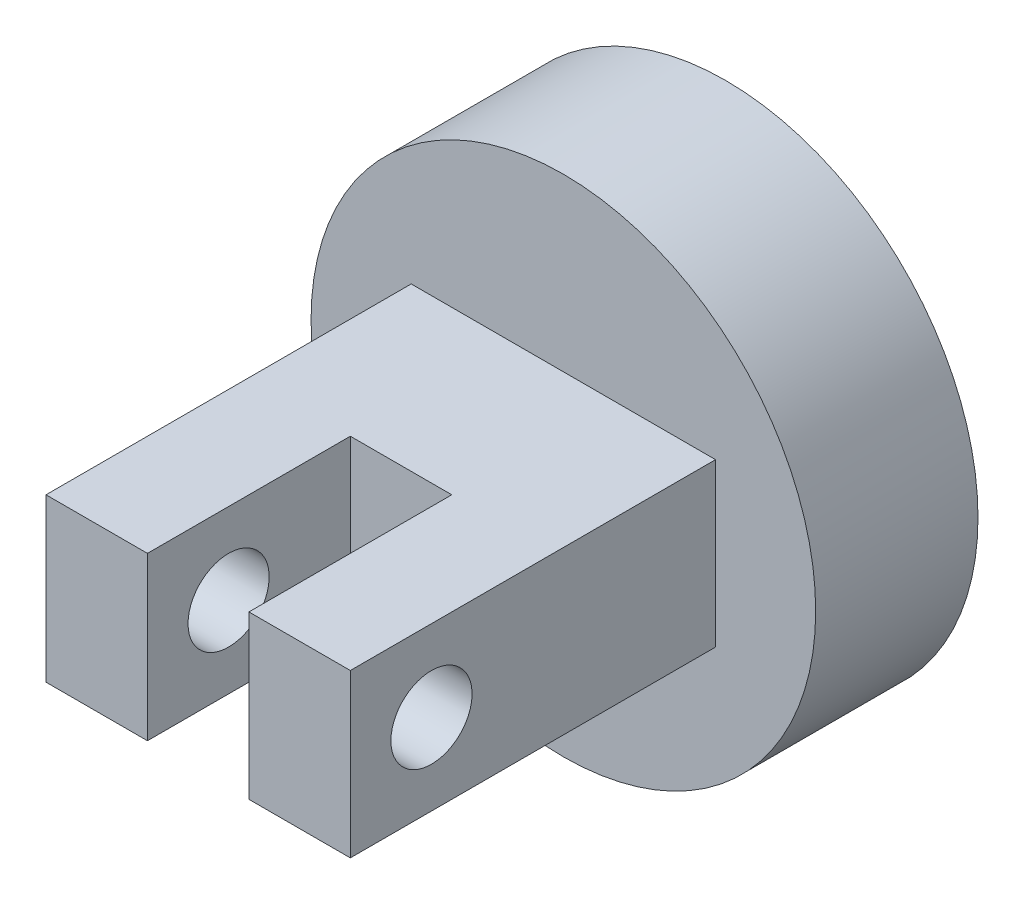
ISO-10303-21;
HEADER;
FILE_DESCRIPTION(('STEP AP214'),'2;1');
FILE_NAME('part.step','',(''),(''),'','','');
FILE_SCHEMA(('AUTOMOTIVE_DESIGN { 1 0 10303 214 1 1 1 1 }'));
ENDSEC;
DATA;
#1=APPLICATION_CONTEXT('core data for automotive mechanical design processes');
#2=APPLICATION_PROTOCOL_DEFINITION('international standard','automotive_design',2000,#1);
#3=PRODUCT_CONTEXT('',#1,'mechanical');
#4=PRODUCT('Part','Part','',(#3));
#5=PRODUCT_RELATED_PRODUCT_CATEGORY('part','',(#4));
#6=PRODUCT_DEFINITION_FORMATION('','',#4);
#7=PRODUCT_DEFINITION_CONTEXT('part definition',#1,'design');
#8=PRODUCT_DEFINITION('design','',#6,#7);
#9=PRODUCT_DEFINITION_SHAPE('','',#8);
#10=(LENGTH_UNIT() NAMED_UNIT(*) SI_UNIT(.MILLI.,.METRE.));
#11=(NAMED_UNIT(*) PLANE_ANGLE_UNIT() SI_UNIT($,.RADIAN.));
#12=(NAMED_UNIT(*) SI_UNIT($,.STERADIAN.) SOLID_ANGLE_UNIT());
#13=UNCERTAINTY_MEASURE_WITH_UNIT(LENGTH_MEASURE(1.E-05),#10,'distance_accuracy_value','');
#14=(GEOMETRIC_REPRESENTATION_CONTEXT(3) GLOBAL_UNCERTAINTY_ASSIGNED_CONTEXT((#13)) GLOBAL_UNIT_ASSIGNED_CONTEXT((#10,
#11,#12)) REPRESENTATION_CONTEXT('',''));
#15=CARTESIAN_POINT('',(0.,0.,0.));
#16=DIRECTION('',(0.,0.,1.));
#17=DIRECTION('',(1.,0.,0.));
#18=AXIS2_PLACEMENT_3D('',#15,#16,#17);
#19=CARTESIAN_POINT('',(0.,0.,260.));
#20=DIRECTION('',(0.,0.,-1.));
#21=DIRECTION('',(-1.,0.,0.));
#22=AXIS2_PLACEMENT_3D('',#19,#20,#21);
#23=PLANE('',#22);
#24=DIRECTION('',(1.,0.,0.));
#25=VECTOR('',#24,1.);
#26=CARTESIAN_POINT('',(-75.,-40.,260.));
#27=LINE('',#26,#25);
#28=CARTESIAN_POINT('',(-75.,-40.,260.));
#29=VERTEX_POINT('',#28);
#30=CARTESIAN_POINT('',(-25.,-40.,260.));
#31=VERTEX_POINT('',#30);
#32=EDGE_CURVE('E115',#29,#31,#27,.T.);
#33=ORIENTED_EDGE('',*,*,#32,.T.);
#34=DIRECTION('',(0.,1.,0.));
#35=VECTOR('',#34,1.);
#36=CARTESIAN_POINT('',(-25.,-220.,260.));
#37=LINE('',#36,#35);
#38=CARTESIAN_POINT('',(-25.,40.,260.));
#39=VERTEX_POINT('',#38);
#40=EDGE_CURVE('E101',#31,#39,#37,.T.);
#41=ORIENTED_EDGE('',*,*,#40,.T.);
#42=DIRECTION('',(-1.,0.,0.));
#43=VECTOR('',#42,1.);
#44=CARTESIAN_POINT('',(-75.,40.,260.));
#45=LINE('',#44,#43);
#46=CARTESIAN_POINT('',(-75.,40.,260.));
#47=VERTEX_POINT('',#46);
#48=EDGE_CURVE('E113',#39,#47,#45,.T.);
#49=ORIENTED_EDGE('',*,*,#48,.T.);
#50=DIRECTION('',(0.,-1.,0.));
#51=VECTOR('',#50,1.);
#52=CARTESIAN_POINT('',(-75.,-40.,260.));
#53=LINE('',#52,#51);
#54=EDGE_CURVE('E127',#47,#29,#53,.T.);
#55=ORIENTED_EDGE('',*,*,#54,.T.);
#56=EDGE_LOOP('',(#33,#41,#49,#55));
#57=FACE_BOUND('',#56,.T.);
#58=ADVANCED_FACE('F32',(#57),#23,.F.);
#59=CARTESIAN_POINT('',(185.,0.,220.));
#60=DIRECTION('',(-1.,0.,0.));
#61=DIRECTION('',(0.,0.,1.));
#62=AXIS2_PLACEMENT_3D('',#59,#60,#61);
#63=CYLINDRICAL_SURFACE('',#62,20.);
#64=CARTESIAN_POINT('',(-25.,0.,220.));
#65=DIRECTION('',(-1.,0.,0.));
#66=DIRECTION('',(0.,0.,1.));
#67=AXIS2_PLACEMENT_3D('',#64,#65,#66);
#68=CIRCLE('',#67,20.);
#69=CARTESIAN_POINT('',(-25.,0.,240.));
#70=VERTEX_POINT('',#69);
#71=EDGE_CURVE('E163',#70,#70,#68,.F.);
#72=ORIENTED_EDGE('',*,*,#71,.T.);
#73=EDGE_LOOP('',(#72));
#74=FACE_BOUND('',#73,.T.);
#75=CARTESIAN_POINT('',(-75.,0.,220.));
#76=DIRECTION('',(-1.,0.,0.));
#77=DIRECTION('',(0.,0.,1.));
#78=AXIS2_PLACEMENT_3D('',#75,#76,#77);
#79=CIRCLE('',#78,20.);
#80=CARTESIAN_POINT('',(-75.,0.,240.));
#81=VERTEX_POINT('',#80);
#82=EDGE_CURVE('E168',#81,#81,#79,.T.);
#83=ORIENTED_EDGE('',*,*,#82,.T.);
#84=EDGE_LOOP('',(#83));
#85=FACE_BOUND('',#84,.T.);
#86=ADVANCED_FACE('F187',(#74,#85),#63,.F.);
#87=CARTESIAN_POINT('',(0.,0.,80.));
#88=DIRECTION('',(0.,0.,1.));
#89=DIRECTION('',(1.,0.,0.));
#90=AXIS2_PLACEMENT_3D('',#87,#88,#89);
#91=PLANE('',#90);
#92=CARTESIAN_POINT('',(0.,0.,80.));
#93=DIRECTION('',(0.,0.,1.));
#94=DIRECTION('',(1.,0.,0.));
#95=AXIS2_PLACEMENT_3D('',#92,#93,#94);
#96=CIRCLE('',#95,124.360538226706);
#97=CARTESIAN_POINT('',(124.360538226706,0.,80.));
#98=VERTEX_POINT('',#97);
#99=EDGE_CURVE('E40',#98,#98,#96,.T.);
#100=ORIENTED_EDGE('',*,*,#99,.T.);
#101=EDGE_LOOP('',(#100));
#102=FACE_BOUND('',#101,.T.);
#103=DIRECTION('',(1.,0.,0.));
#104=VECTOR('',#103,1.);
#105=CARTESIAN_POINT('',(0.,40.,80.));
#106=LINE('',#105,#104);
#107=CARTESIAN_POINT('',(-75.,40.,80.));
#108=VERTEX_POINT('',#107);
#109=CARTESIAN_POINT('',(75.,40.,80.));
#110=VERTEX_POINT('',#109);
#111=EDGE_CURVE('E150',#108,#110,#106,.T.);
#112=ORIENTED_EDGE('',*,*,#111,.T.);
#113=DIRECTION('',(0.,-1.,0.));
#114=VECTOR('',#113,1.);
#115=CARTESIAN_POINT('',(75.,0.,80.));
#116=LINE('',#115,#114);
#117=CARTESIAN_POINT('',(75.,-40.,80.));
#118=VERTEX_POINT('',#117);
#119=EDGE_CURVE('E153',#110,#118,#116,.T.);
#120=ORIENTED_EDGE('',*,*,#119,.T.);
#121=DIRECTION('',(-1.,0.,0.));
#122=VECTOR('',#121,1.);
#123=CARTESIAN_POINT('',(0.,-40.,80.));
#124=LINE('',#123,#122);
#125=CARTESIAN_POINT('',(-75.,-40.,80.));
#126=VERTEX_POINT('',#125);
#127=EDGE_CURVE('E144',#118,#126,#124,.T.);
#128=ORIENTED_EDGE('',*,*,#127,.T.);
#129=DIRECTION('',(0.,1.,0.));
#130=VECTOR('',#129,1.);
#131=CARTESIAN_POINT('',(-75.,0.,80.));
#132=LINE('',#131,#130);
#133=EDGE_CURVE('E147',#126,#108,#132,.T.);
#134=ORIENTED_EDGE('',*,*,#133,.T.);
#135=EDGE_LOOP('',(#112,#120,#128,#134));
#136=FACE_BOUND('',#135,.T.);
#137=ADVANCED_FACE('F199',(#102,#136),#91,.T.);
#138=CARTESIAN_POINT('',(0.,0.,80.));
#139=DIRECTION('',(0.,0.,-1.));
#140=DIRECTION('',(-1.,0.,0.));
#141=AXIS2_PLACEMENT_3D('',#138,#139,#140);
#142=CYLINDRICAL_SURFACE('',#141,124.360538226706);
#143=ORIENTED_EDGE('',*,*,#99,.F.);
#144=EDGE_LOOP('',(#143));
#145=FACE_BOUND('',#144,.T.);
#146=CARTESIAN_POINT('',(0.,0.,0.));
#147=DIRECTION('',(0.,0.,1.));
#148=DIRECTION('',(1.,0.,0.));
#149=AXIS2_PLACEMENT_3D('',#146,#147,#148);
#150=CIRCLE('',#149,124.360538226706);
#151=CARTESIAN_POINT('',(124.360538226706,0.,0.));
#152=VERTEX_POINT('',#151);
#153=EDGE_CURVE('E156',#152,#152,#150,.T.);
#154=ORIENTED_EDGE('',*,*,#153,.T.);
#155=EDGE_LOOP('',(#154));
#156=FACE_BOUND('',#155,.T.);
#157=ADVANCED_FACE('F34',(#145,#156),#142,.T.);
#158=CARTESIAN_POINT('',(0.,0.,0.));
#159=DIRECTION('',(0.,0.,1.));
#160=DIRECTION('',(1.,0.,0.));
#161=AXIS2_PLACEMENT_3D('',#158,#159,#160);
#162=PLANE('',#161);
#163=ORIENTED_EDGE('',*,*,#153,.F.);
#164=EDGE_LOOP('',(#163));
#165=FACE_BOUND('',#164,.T.);
#166=ADVANCED_FACE('F214',(#165),#162,.F.);
#167=CARTESIAN_POINT('',(75.,-40.,260.));
#168=DIRECTION('',(-1.,0.,0.));
#169=DIRECTION('',(0.,0.,1.));
#170=AXIS2_PLACEMENT_3D('',#167,#168,#169);
#171=PLANE('',#170);
#172=CARTESIAN_POINT('',(75.,0.,220.));
#173=DIRECTION('',(-1.,0.,0.));
#174=DIRECTION('',(0.,0.,1.));
#175=AXIS2_PLACEMENT_3D('',#172,#173,#174);
#176=CIRCLE('',#175,20.);
#177=CARTESIAN_POINT('',(75.,0.,240.));
#178=VERTEX_POINT('',#177);
#179=EDGE_CURVE('E129',#178,#178,#176,.T.);
#180=ORIENTED_EDGE('',*,*,#179,.T.);
#181=EDGE_LOOP('',(#180));
#182=FACE_BOUND('',#181,.T.);
#183=ORIENTED_EDGE('',*,*,#119,.F.);
#184=DIRECTION('',(0.,0.,-1.));
#185=VECTOR('',#184,1.);
#186=CARTESIAN_POINT('',(75.,40.,260.));
#187=LINE('',#186,#185);
#188=CARTESIAN_POINT('',(75.,40.,260.));
#189=VERTEX_POINT('',#188);
#190=EDGE_CURVE('E141',#189,#110,#187,.T.);
#191=ORIENTED_EDGE('',*,*,#190,.F.);
#192=DIRECTION('',(0.,1.,0.));
#193=VECTOR('',#192,1.);
#194=CARTESIAN_POINT('',(75.,-40.,260.));
#195=LINE('',#194,#193);
#196=CARTESIAN_POINT('',(75.,-40.,260.));
#197=VERTEX_POINT('',#196);
#198=EDGE_CURVE('E124',#197,#189,#195,.T.);
#199=ORIENTED_EDGE('',*,*,#198,.F.);
#200=DIRECTION('',(0.,0.,-1.));
#201=VECTOR('',#200,1.);
#202=CARTESIAN_POINT('',(75.,-40.,260.));
#203=LINE('',#202,#201);
#204=EDGE_CURVE('E136',#197,#118,#203,.T.);
#205=ORIENTED_EDGE('',*,*,#204,.T.);
#206=EDGE_LOOP('',(#183,#191,#199,#205));
#207=FACE_BOUND('',#206,.T.);
#208=ADVANCED_FACE('F178',(#182,#207),#171,.F.);
#209=CARTESIAN_POINT('',(-75.,40.,260.));
#210=DIRECTION('',(0.,-1.,0.));
#211=DIRECTION('',(0.,0.,-1.));
#212=AXIS2_PLACEMENT_3D('',#209,#210,#211);
#213=PLANE('',#212);
#214=ORIENTED_EDGE('',*,*,#48,.F.);
#215=DIRECTION('',(0.,0.,1.));
#216=VECTOR('',#215,1.);
#217=CARTESIAN_POINT('',(-25.,40.,260.));
#218=LINE('',#217,#216);
#219=CARTESIAN_POINT('',(-25.,40.,160.));
#220=VERTEX_POINT('',#219);
#221=EDGE_CURVE('E98',#220,#39,#218,.T.);
#222=ORIENTED_EDGE('',*,*,#221,.F.);
#223=DIRECTION('',(-1.,0.,0.));
#224=VECTOR('',#223,1.);
#225=CARTESIAN_POINT('',(-25.,40.,160.));
#226=LINE('',#225,#224);
#227=CARTESIAN_POINT('',(25.,40.,160.));
#228=VERTEX_POINT('',#227);
#229=EDGE_CURVE('E117',#228,#220,#226,.T.);
#230=ORIENTED_EDGE('',*,*,#229,.F.);
#231=DIRECTION('',(0.,0.,-1.));
#232=VECTOR('',#231,1.);
#233=CARTESIAN_POINT('',(25.,40.,260.));
#234=LINE('',#233,#232);
#235=CARTESIAN_POINT('',(25.,40.,260.));
#236=VERTEX_POINT('',#235);
#237=EDGE_CURVE('E109',#236,#228,#234,.T.);
#238=ORIENTED_EDGE('',*,*,#237,.F.);
#239=EDGE_CURVE('E123',#189,#236,#45,.T.);
#240=ORIENTED_EDGE('',*,*,#239,.F.);
#241=ORIENTED_EDGE('',*,*,#190,.T.);
#242=ORIENTED_EDGE('',*,*,#111,.F.);
#243=DIRECTION('',(0.,0.,-1.));
#244=VECTOR('',#243,1.);
#245=CARTESIAN_POINT('',(-75.,40.,260.));
#246=LINE('',#245,#244);
#247=EDGE_CURVE('E121',#47,#108,#246,.T.);
#248=ORIENTED_EDGE('',*,*,#247,.F.);
#249=EDGE_LOOP('',(#214,#222,#230,#238,#240,#241,#242,#248));
#250=FACE_BOUND('',#249,.T.);
#251=ADVANCED_FACE('F119',(#250),#213,.F.);
#252=CARTESIAN_POINT('',(-75.,-40.,260.));
#253=DIRECTION('',(1.,0.,0.));
#254=DIRECTION('',(0.,0.,-1.));
#255=AXIS2_PLACEMENT_3D('',#252,#253,#254);
#256=PLANE('',#255);
#257=ORIENTED_EDGE('',*,*,#82,.F.);
#258=EDGE_LOOP('',(#257));
#259=FACE_BOUND('',#258,.T.);
#260=ORIENTED_EDGE('',*,*,#133,.F.);
#261=DIRECTION('',(0.,0.,-1.));
#262=VECTOR('',#261,1.);
#263=CARTESIAN_POINT('',(-75.,-40.,260.));
#264=LINE('',#263,#262);
#265=EDGE_CURVE('E55',#29,#126,#264,.T.);
#266=ORIENTED_EDGE('',*,*,#265,.F.);
#267=ORIENTED_EDGE('',*,*,#54,.F.);
#268=ORIENTED_EDGE('',*,*,#247,.T.);
#269=EDGE_LOOP('',(#260,#266,#267,#268));
#270=FACE_BOUND('',#269,.T.);
#271=ADVANCED_FACE('F206',(#259,#270),#256,.F.);
#272=CARTESIAN_POINT('',(-75.,-40.,260.));
#273=DIRECTION('',(0.,1.,0.));
#274=DIRECTION('',(0.,0.,1.));
#275=AXIS2_PLACEMENT_3D('',#272,#273,#274);
#276=PLANE('',#275);
#277=DIRECTION('',(-1.,0.,0.));
#278=VECTOR('',#277,1.);
#279=CARTESIAN_POINT('',(-75.,-40.,160.));
#280=LINE('',#279,#278);
#281=CARTESIAN_POINT('',(25.,-40.,160.));
#282=VERTEX_POINT('',#281);
#283=CARTESIAN_POINT('',(-25.,-40.,160.));
#284=VERTEX_POINT('',#283);
#285=EDGE_CURVE('E11',#282,#284,#280,.T.);
#286=ORIENTED_EDGE('',*,*,#285,.T.);
#287=DIRECTION('',(0.,0.,1.));
#288=VECTOR('',#287,1.);
#289=CARTESIAN_POINT('',(-25.,-40.,260.));
#290=LINE('',#289,#288);
#291=EDGE_CURVE('E165',#284,#31,#290,.T.);
#292=ORIENTED_EDGE('',*,*,#291,.T.);
#293=ORIENTED_EDGE('',*,*,#32,.F.);
#294=ORIENTED_EDGE('',*,*,#265,.T.);
#295=ORIENTED_EDGE('',*,*,#127,.F.);
#296=ORIENTED_EDGE('',*,*,#204,.F.);
#297=CARTESIAN_POINT('',(25.,-40.,260.));
#298=VERTEX_POINT('',#297);
#299=EDGE_CURVE('E134',#298,#197,#27,.T.);
#300=ORIENTED_EDGE('',*,*,#299,.F.);
#301=DIRECTION('',(0.,0.,-1.));
#302=VECTOR('',#301,1.);
#303=CARTESIAN_POINT('',(25.,-40.,260.));
#304=LINE('',#303,#302);
#305=EDGE_CURVE('E47',#298,#282,#304,.T.);
#306=ORIENTED_EDGE('',*,*,#305,.T.);
#307=EDGE_LOOP('',(#286,#292,#293,#294,#295,#296,#300,#306));
#308=FACE_BOUND('',#307,.T.);
#309=ADVANCED_FACE('F194',(#308),#276,.F.);
#310=ORIENTED_EDGE('',*,*,#239,.T.);
#311=DIRECTION('',(0.,1.,0.));
#312=VECTOR('',#311,1.);
#313=CARTESIAN_POINT('',(25.,-220.,260.));
#314=LINE('',#313,#312);
#315=EDGE_CURVE('E116',#298,#236,#314,.T.);
#316=ORIENTED_EDGE('',*,*,#315,.F.);
#317=ORIENTED_EDGE('',*,*,#299,.T.);
#318=ORIENTED_EDGE('',*,*,#198,.T.);
#319=EDGE_LOOP('',(#310,#316,#317,#318));
#320=FACE_BOUND('',#319,.T.);
#321=ADVANCED_FACE('F184',(#320),#23,.F.);
#322=CARTESIAN_POINT('',(25.,0.,220.));
#323=DIRECTION('',(1.,0.,0.));
#324=DIRECTION('',(0.,0.,-1.));
#325=AXIS2_PLACEMENT_3D('',#322,#323,#324);
#326=CIRCLE('',#325,20.);
#327=CARTESIAN_POINT('',(25.,0.,200.));
#328=VERTEX_POINT('',#327);
#329=EDGE_CURVE('E161',#328,#328,#326,.F.);
#330=ORIENTED_EDGE('',*,*,#329,.T.);
#331=EDGE_LOOP('',(#330));
#332=FACE_BOUND('',#331,.T.);
#333=ORIENTED_EDGE('',*,*,#179,.F.);
#334=EDGE_LOOP('',(#333));
#335=FACE_BOUND('',#334,.T.);
#336=ADVANCED_FACE('F181',(#332,#335),#63,.F.);
#337=CARTESIAN_POINT('',(-25.,-220.,160.));
#338=DIRECTION('',(0.,0.,-1.));
#339=DIRECTION('',(-1.,0.,0.));
#340=AXIS2_PLACEMENT_3D('',#337,#338,#339);
#341=PLANE('',#340);
#342=DIRECTION('',(0.,1.,0.));
#343=VECTOR('',#342,1.);
#344=CARTESIAN_POINT('',(25.,-220.,160.));
#345=LINE('',#344,#343);
#346=EDGE_CURVE('E231',#282,#228,#345,.T.);
#347=ORIENTED_EDGE('',*,*,#346,.T.);
#348=ORIENTED_EDGE('',*,*,#229,.T.);
#349=DIRECTION('',(0.,1.,0.));
#350=VECTOR('',#349,1.);
#351=CARTESIAN_POINT('',(-25.,-220.,160.));
#352=LINE('',#351,#350);
#353=EDGE_CURVE('E104',#284,#220,#352,.T.);
#354=ORIENTED_EDGE('',*,*,#353,.F.);
#355=ORIENTED_EDGE('',*,*,#285,.F.);
#356=EDGE_LOOP('',(#347,#348,#354,#355));
#357=FACE_BOUND('',#356,.T.);
#358=ADVANCED_FACE('F183',(#357),#341,.F.);
#359=CARTESIAN_POINT('',(-25.,-220.,260.));
#360=DIRECTION('',(-1.,0.,0.));
#361=DIRECTION('',(0.,0.,1.));
#362=AXIS2_PLACEMENT_3D('',#359,#360,#361);
#363=PLANE('',#362);
#364=ORIENTED_EDGE('',*,*,#71,.F.);
#365=EDGE_LOOP('',(#364));
#366=FACE_BOUND('',#365,.T.);
#367=ORIENTED_EDGE('',*,*,#353,.T.);
#368=ORIENTED_EDGE('',*,*,#221,.T.);
#369=ORIENTED_EDGE('',*,*,#40,.F.);
#370=ORIENTED_EDGE('',*,*,#291,.F.);
#371=EDGE_LOOP('',(#367,#368,#369,#370));
#372=FACE_BOUND('',#371,.T.);
#373=ADVANCED_FACE('F100',(#366,#372),#363,.F.);
#374=CARTESIAN_POINT('',(25.,-220.,260.));
#375=DIRECTION('',(1.,0.,0.));
#376=DIRECTION('',(0.,0.,-1.));
#377=AXIS2_PLACEMENT_3D('',#374,#375,#376);
#378=PLANE('',#377);
#379=ORIENTED_EDGE('',*,*,#329,.F.);
#380=EDGE_LOOP('',(#379));
#381=FACE_BOUND('',#380,.T.);
#382=ORIENTED_EDGE('',*,*,#315,.T.);
#383=ORIENTED_EDGE('',*,*,#237,.T.);
#384=ORIENTED_EDGE('',*,*,#346,.F.);
#385=ORIENTED_EDGE('',*,*,#305,.F.);
#386=EDGE_LOOP('',(#382,#383,#384,#385));
#387=FACE_BOUND('',#386,.T.);
#388=ADVANCED_FACE('F238',(#381,#387),#378,.F.);
#389=CLOSED_SHELL('',(#58,#86,#137,#157,#166,#208,#251,#271,#309,#321,#336,#358,#373,#388));
#390=MANIFOLD_SOLID_BREP('B2',#389);
#391=ADVANCED_BREP_SHAPE_REPRESENTATION('',(#18,#390),#14);
#392=SHAPE_DEFINITION_REPRESENTATION(#9,#391);
ENDSEC;
END-ISO-10303-21;
